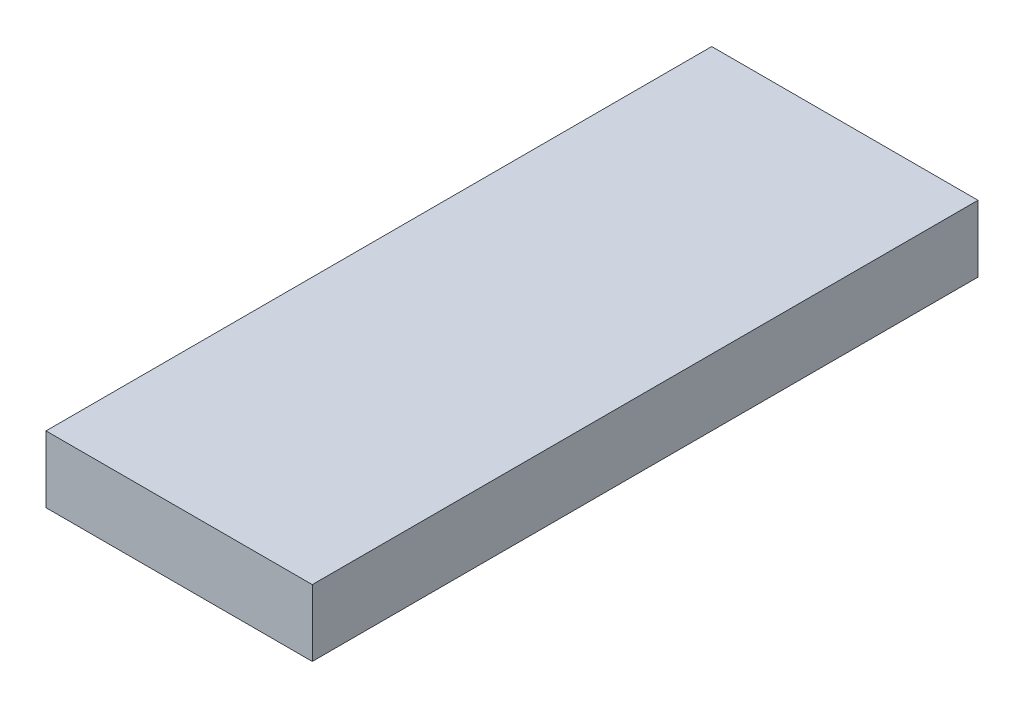
ISO-10303-21;
HEADER;
FILE_DESCRIPTION(('STEP AP214'),'2;1');
FILE_NAME('part.step','',(''),(''),'','','');
FILE_SCHEMA(('AUTOMOTIVE_DESIGN { 1 0 10303 214 1 1 1 1 }'));
ENDSEC;
DATA;
#1=APPLICATION_CONTEXT('core data for automotive mechanical design processes');
#2=APPLICATION_PROTOCOL_DEFINITION('international standard','automotive_design',2000,#1);
#3=PRODUCT_CONTEXT('',#1,'mechanical');
#4=PRODUCT('Part','Part','',(#3));
#5=PRODUCT_RELATED_PRODUCT_CATEGORY('part','',(#4));
#6=PRODUCT_DEFINITION_FORMATION('','',#4);
#7=PRODUCT_DEFINITION_CONTEXT('part definition',#1,'design');
#8=PRODUCT_DEFINITION('design','',#6,#7);
#9=PRODUCT_DEFINITION_SHAPE('','',#8);
#10=(LENGTH_UNIT() NAMED_UNIT(*) SI_UNIT(.MILLI.,.METRE.));
#11=(NAMED_UNIT(*) PLANE_ANGLE_UNIT() SI_UNIT($,.RADIAN.));
#12=(NAMED_UNIT(*) SI_UNIT($,.STERADIAN.) SOLID_ANGLE_UNIT());
#13=UNCERTAINTY_MEASURE_WITH_UNIT(LENGTH_MEASURE(1.E-05),#10,'distance_accuracy_value','');
#14=(GEOMETRIC_REPRESENTATION_CONTEXT(3) GLOBAL_UNCERTAINTY_ASSIGNED_CONTEXT((#13)) GLOBAL_UNIT_ASSIGNED_CONTEXT((#10,
#11,#12)) REPRESENTATION_CONTEXT('',''));
#15=CARTESIAN_POINT('',(0.,0.,0.));
#16=DIRECTION('',(0.,0.,1.));
#17=DIRECTION('',(1.,0.,0.));
#18=AXIS2_PLACEMENT_3D('',#15,#16,#17);
#19=CARTESIAN_POINT('',(80.,20.,200.));
#20=DIRECTION('',(-1.,0.,0.));
#21=DIRECTION('',(0.,0.,1.));
#22=AXIS2_PLACEMENT_3D('',#19,#20,#21);
#23=PLANE('',#22);
#24=DIRECTION('',(0.,1.,0.));
#25=VECTOR('',#24,1.);
#26=CARTESIAN_POINT('',(80.,20.,0.));
#27=LINE('',#26,#25);
#28=CARTESIAN_POINT('',(80.,0.,0.));
#29=VERTEX_POINT('',#28);
#30=CARTESIAN_POINT('',(80.,20.,0.));
#31=VERTEX_POINT('',#30);
#32=EDGE_CURVE('E111',#29,#31,#27,.T.);
#33=ORIENTED_EDGE('',*,*,#32,.T.);
#34=DIRECTION('',(0.,0.,-1.));
#35=VECTOR('',#34,1.);
#36=CARTESIAN_POINT('',(80.,20.,200.));
#37=LINE('',#36,#35);
#38=CARTESIAN_POINT('',(80.,20.,200.));
#39=VERTEX_POINT('',#38);
#40=EDGE_CURVE('E11',#39,#31,#37,.T.);
#41=ORIENTED_EDGE('',*,*,#40,.F.);
#42=DIRECTION('',(0.,1.,0.));
#43=VECTOR('',#42,1.);
#44=CARTESIAN_POINT('',(80.,20.,200.));
#45=LINE('',#44,#43);
#46=CARTESIAN_POINT('',(80.,0.,200.));
#47=VERTEX_POINT('',#46);
#48=EDGE_CURVE('E95',#47,#39,#45,.T.);
#49=ORIENTED_EDGE('',*,*,#48,.F.);
#50=DIRECTION('',(0.,0.,-1.));
#51=VECTOR('',#50,1.);
#52=CARTESIAN_POINT('',(80.,0.,200.));
#53=LINE('',#52,#51);
#54=EDGE_CURVE('E107',#47,#29,#53,.T.);
#55=ORIENTED_EDGE('',*,*,#54,.T.);
#56=EDGE_LOOP('',(#33,#41,#49,#55));
#57=FACE_BOUND('',#56,.T.);
#58=ADVANCED_FACE('F43',(#57),#23,.F.);
#59=CARTESIAN_POINT('',(80.,20.,200.));
#60=DIRECTION('',(0.,-1.,0.));
#61=DIRECTION('',(1.,0.,0.));
#62=AXIS2_PLACEMENT_3D('',#59,#60,#61);
#63=PLANE('',#62);
#64=DIRECTION('',(-1.,0.,0.));
#65=VECTOR('',#64,1.);
#66=CARTESIAN_POINT('',(80.,20.,0.));
#67=LINE('',#66,#65);
#68=CARTESIAN_POINT('',(0.,20.,0.));
#69=VERTEX_POINT('',#68);
#70=EDGE_CURVE('E100',#31,#69,#67,.T.);
#71=ORIENTED_EDGE('',*,*,#70,.T.);
#72=DIRECTION('',(0.,0.,-1.));
#73=VECTOR('',#72,1.);
#74=CARTESIAN_POINT('',(0.,20.,200.));
#75=LINE('',#74,#73);
#76=CARTESIAN_POINT('',(0.,20.,200.));
#77=VERTEX_POINT('',#76);
#78=EDGE_CURVE('E52',#77,#69,#75,.T.);
#79=ORIENTED_EDGE('',*,*,#78,.F.);
#80=DIRECTION('',(-1.,0.,0.));
#81=VECTOR('',#80,1.);
#82=CARTESIAN_POINT('',(80.,20.,200.));
#83=LINE('',#82,#81);
#84=EDGE_CURVE('E90',#39,#77,#83,.T.);
#85=ORIENTED_EDGE('',*,*,#84,.F.);
#86=ORIENTED_EDGE('',*,*,#40,.T.);
#87=EDGE_LOOP('',(#71,#79,#85,#86));
#88=FACE_BOUND('',#87,.T.);
#89=ADVANCED_FACE('F99',(#88),#63,.F.);
#90=CARTESIAN_POINT('',(0.,20.,200.));
#91=DIRECTION('',(1.,0.,0.));
#92=DIRECTION('',(0.,0.,-1.));
#93=AXIS2_PLACEMENT_3D('',#90,#91,#92);
#94=PLANE('',#93);
#95=DIRECTION('',(0.,-1.,0.));
#96=VECTOR('',#95,1.);
#97=CARTESIAN_POINT('',(0.,20.,0.));
#98=LINE('',#97,#96);
#99=CARTESIAN_POINT('',(0.,0.,0.));
#100=VERTEX_POINT('',#99);
#101=EDGE_CURVE('E77',#69,#100,#98,.T.);
#102=ORIENTED_EDGE('',*,*,#101,.T.);
#103=DIRECTION('',(0.,0.,-1.));
#104=VECTOR('',#103,1.);
#105=CARTESIAN_POINT('',(0.,0.,200.));
#106=LINE('',#105,#104);
#107=CARTESIAN_POINT('',(0.,0.,200.));
#108=VERTEX_POINT('',#107);
#109=EDGE_CURVE('E102',#108,#100,#106,.T.);
#110=ORIENTED_EDGE('',*,*,#109,.F.);
#111=DIRECTION('',(0.,-1.,0.));
#112=VECTOR('',#111,1.);
#113=CARTESIAN_POINT('',(0.,20.,200.));
#114=LINE('',#113,#112);
#115=EDGE_CURVE('E93',#77,#108,#114,.T.);
#116=ORIENTED_EDGE('',*,*,#115,.F.);
#117=ORIENTED_EDGE('',*,*,#78,.T.);
#118=EDGE_LOOP('',(#102,#110,#116,#117));
#119=FACE_BOUND('',#118,.T.);
#120=ADVANCED_FACE('F103',(#119),#94,.F.);
#121=CARTESIAN_POINT('',(80.,0.,200.));
#122=DIRECTION('',(0.,1.,0.));
#123=DIRECTION('',(-1.,0.,0.));
#124=AXIS2_PLACEMENT_3D('',#121,#122,#123);
#125=PLANE('',#124);
#126=DIRECTION('',(1.,0.,0.));
#127=VECTOR('',#126,1.);
#128=CARTESIAN_POINT('',(80.,0.,0.));
#129=LINE('',#128,#127);
#130=EDGE_CURVE('E83',#100,#29,#129,.T.);
#131=ORIENTED_EDGE('',*,*,#130,.T.);
#132=ORIENTED_EDGE('',*,*,#54,.F.);
#133=DIRECTION('',(1.,0.,0.));
#134=VECTOR('',#133,1.);
#135=CARTESIAN_POINT('',(80.,0.,200.));
#136=LINE('',#135,#134);
#137=EDGE_CURVE('E60',#108,#47,#136,.T.);
#138=ORIENTED_EDGE('',*,*,#137,.F.);
#139=ORIENTED_EDGE('',*,*,#109,.T.);
#140=EDGE_LOOP('',(#131,#132,#138,#139));
#141=FACE_BOUND('',#140,.T.);
#142=ADVANCED_FACE('F124',(#141),#125,.F.);
#143=CARTESIAN_POINT('',(0.,0.,200.));
#144=DIRECTION('',(0.,0.,-1.));
#145=DIRECTION('',(-1.,0.,0.));
#146=AXIS2_PLACEMENT_3D('',#143,#144,#145);
#147=PLANE('',#146);
#148=ORIENTED_EDGE('',*,*,#48,.T.);
#149=ORIENTED_EDGE('',*,*,#84,.T.);
#150=ORIENTED_EDGE('',*,*,#115,.T.);
#151=ORIENTED_EDGE('',*,*,#137,.T.);
#152=EDGE_LOOP('',(#148,#149,#150,#151));
#153=FACE_BOUND('',#152,.T.);
#154=ADVANCED_FACE('F91',(#153),#147,.F.);
#155=CARTESIAN_POINT('',(0.,0.,0.));
#156=DIRECTION('',(0.,0.,-1.));
#157=DIRECTION('',(-1.,0.,0.));
#158=AXIS2_PLACEMENT_3D('',#155,#156,#157);
#159=PLANE('',#158);
#160=ORIENTED_EDGE('',*,*,#32,.F.);
#161=ORIENTED_EDGE('',*,*,#130,.F.);
#162=ORIENTED_EDGE('',*,*,#101,.F.);
#163=ORIENTED_EDGE('',*,*,#70,.F.);
#164=EDGE_LOOP('',(#160,#161,#162,#163));
#165=FACE_BOUND('',#164,.T.);
#166=ADVANCED_FACE('F127',(#165),#159,.T.);
#167=CLOSED_SHELL('',(#58,#89,#120,#142,#154,#166));
#168=MANIFOLD_SOLID_BREP('B2',#167);
#169=ADVANCED_BREP_SHAPE_REPRESENTATION('',(#18,#168),#14);
#170=SHAPE_DEFINITION_REPRESENTATION(#9,#169);
ENDSEC;
END-ISO-10303-21;
